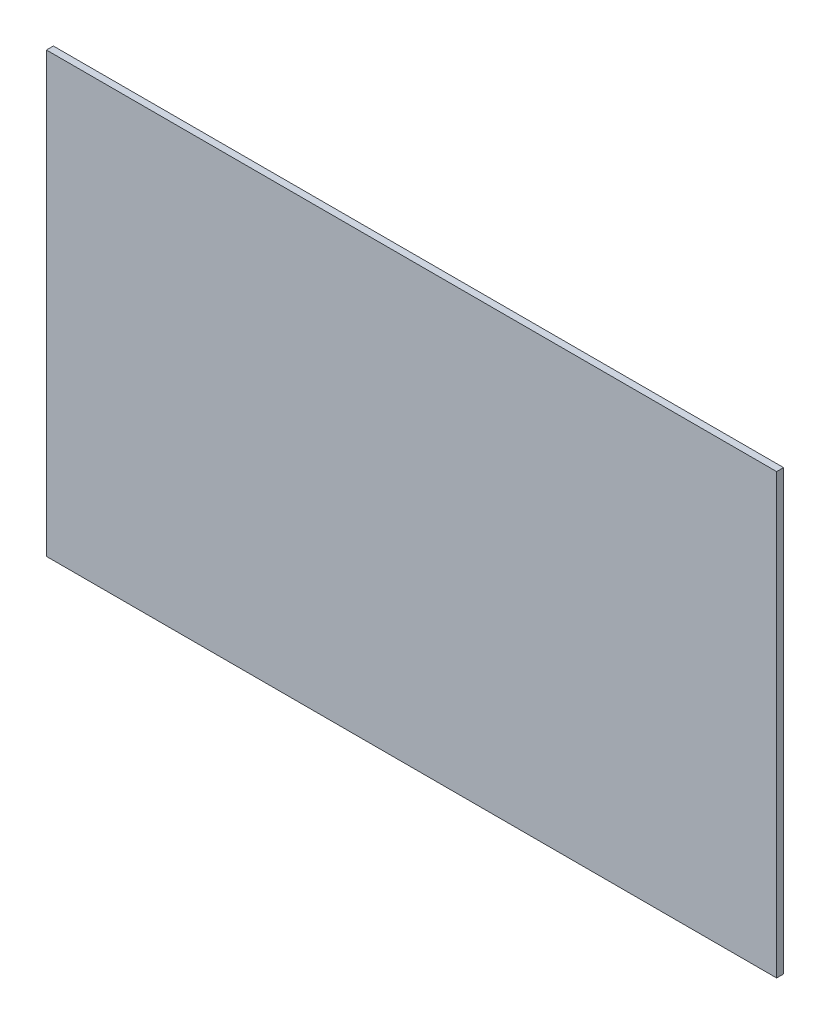
ISO-10303-21;
HEADER;
FILE_DESCRIPTION(('STEP AP214'),'2;1');
FILE_NAME('part.step','',(''),(''),'','','');
FILE_SCHEMA(('AUTOMOTIVE_DESIGN { 1 0 10303 214 1 1 1 1 }'));
ENDSEC;
DATA;
#1=APPLICATION_CONTEXT('core data for automotive mechanical design processes');
#2=APPLICATION_PROTOCOL_DEFINITION('international standard','automotive_design',2000,#1);
#3=PRODUCT_CONTEXT('',#1,'mechanical');
#4=PRODUCT('Part','Part','',(#3));
#5=PRODUCT_RELATED_PRODUCT_CATEGORY('part','',(#4));
#6=PRODUCT_DEFINITION_FORMATION('','',#4);
#7=PRODUCT_DEFINITION_CONTEXT('part definition',#1,'design');
#8=PRODUCT_DEFINITION('design','',#6,#7);
#9=PRODUCT_DEFINITION_SHAPE('','',#8);
#10=(LENGTH_UNIT() NAMED_UNIT(*) SI_UNIT(.MILLI.,.METRE.));
#11=(NAMED_UNIT(*) PLANE_ANGLE_UNIT() SI_UNIT($,.RADIAN.));
#12=(NAMED_UNIT(*) SI_UNIT($,.STERADIAN.) SOLID_ANGLE_UNIT());
#13=UNCERTAINTY_MEASURE_WITH_UNIT(LENGTH_MEASURE(1.E-05),#10,'distance_accuracy_value','');
#14=(GEOMETRIC_REPRESENTATION_CONTEXT(3) GLOBAL_UNCERTAINTY_ASSIGNED_CONTEXT((#13)) GLOBAL_UNIT_ASSIGNED_CONTEXT((#10,
#11,#12)) REPRESENTATION_CONTEXT('',''));
#15=CARTESIAN_POINT('',(0.,0.,0.));
#16=DIRECTION('',(0.,0.,1.));
#17=DIRECTION('',(1.,0.,0.));
#18=AXIS2_PLACEMENT_3D('',#15,#16,#17);
#19=CARTESIAN_POINT('',(-250.4,150.400000000001,4.75));
#20=DIRECTION('',(1.,0.,0.));
#21=DIRECTION('',(0.,1.,0.));
#22=AXIS2_PLACEMENT_3D('',#19,#20,#21);
#23=PLANE('',#22);
#24=DIRECTION('',(0.,-1.,0.));
#25=VECTOR('',#24,1.);
#26=CARTESIAN_POINT('',(-250.4,150.400000000001,0.));
#27=LINE('',#26,#25);
#28=CARTESIAN_POINT('',(-250.4,150.400000000001,0.));
#29=VERTEX_POINT('',#28);
#30=CARTESIAN_POINT('',(-250.4,-150.399999999999,0.));
#31=VERTEX_POINT('',#30);
#32=EDGE_CURVE('E97',#29,#31,#27,.T.);
#33=ORIENTED_EDGE('',*,*,#32,.T.);
#34=DIRECTION('',(0.,0.,-1.));
#35=VECTOR('',#34,1.);
#36=CARTESIAN_POINT('',(-250.4,-150.399999999999,4.75));
#37=LINE('',#36,#35);
#38=CARTESIAN_POINT('',(-250.4,-150.399999999999,4.75));
#39=VERTEX_POINT('',#38);
#40=EDGE_CURVE('E11',#39,#31,#37,.T.);
#41=ORIENTED_EDGE('',*,*,#40,.F.);
#42=DIRECTION('',(0.,-1.,0.));
#43=VECTOR('',#42,1.);
#44=CARTESIAN_POINT('',(-250.4,150.400000000001,4.75));
#45=LINE('',#44,#43);
#46=CARTESIAN_POINT('',(-250.4,150.400000000001,4.75));
#47=VERTEX_POINT('',#46);
#48=EDGE_CURVE('E83',#47,#39,#45,.T.);
#49=ORIENTED_EDGE('',*,*,#48,.F.);
#50=DIRECTION('',(0.,0.,-1.));
#51=VECTOR('',#50,1.);
#52=CARTESIAN_POINT('',(-250.4,150.400000000001,4.75));
#53=LINE('',#52,#51);
#54=EDGE_CURVE('E50',#47,#29,#53,.T.);
#55=ORIENTED_EDGE('',*,*,#54,.T.);
#56=EDGE_LOOP('',(#33,#41,#49,#55));
#57=FACE_BOUND('',#56,.T.);
#58=ADVANCED_FACE('F34',(#57),#23,.F.);
#59=CARTESIAN_POINT('',(-250.4,-150.399999999999,4.75));
#60=DIRECTION('',(0.,1.,0.));
#61=DIRECTION('',(0.,0.,1.));
#62=AXIS2_PLACEMENT_3D('',#59,#60,#61);
#63=PLANE('',#62);
#64=DIRECTION('',(1.,0.,0.));
#65=VECTOR('',#64,1.);
#66=CARTESIAN_POINT('',(-250.4,-150.399999999999,0.));
#67=LINE('',#66,#65);
#68=CARTESIAN_POINT('',(250.4,-150.399999999999,0.));
#69=VERTEX_POINT('',#68);
#70=EDGE_CURVE('E88',#31,#69,#67,.T.);
#71=ORIENTED_EDGE('',*,*,#70,.T.);
#72=DIRECTION('',(0.,0.,-1.));
#73=VECTOR('',#72,1.);
#74=CARTESIAN_POINT('',(250.4,-150.399999999999,4.75));
#75=LINE('',#74,#73);
#76=CARTESIAN_POINT('',(250.4,-150.399999999999,4.75));
#77=VERTEX_POINT('',#76);
#78=EDGE_CURVE('E42',#77,#69,#75,.T.);
#79=ORIENTED_EDGE('',*,*,#78,.F.);
#80=DIRECTION('',(1.,0.,0.));
#81=VECTOR('',#80,1.);
#82=CARTESIAN_POINT('',(-250.4,-150.399999999999,4.75));
#83=LINE('',#82,#81);
#84=EDGE_CURVE('E75',#39,#77,#83,.T.);
#85=ORIENTED_EDGE('',*,*,#84,.F.);
#86=ORIENTED_EDGE('',*,*,#40,.T.);
#87=EDGE_LOOP('',(#71,#79,#85,#86));
#88=FACE_BOUND('',#87,.T.);
#89=ADVANCED_FACE('F87',(#88),#63,.F.);
#90=CARTESIAN_POINT('',(250.4,150.400000000001,4.75));
#91=DIRECTION('',(1.,0.,0.));
#92=DIRECTION('',(0.,1.,0.));
#93=AXIS2_PLACEMENT_3D('',#90,#91,#92);
#94=PLANE('',#93);
#95=DIRECTION('',(0.,-1.,0.));
#96=VECTOR('',#95,1.);
#97=CARTESIAN_POINT('',(250.4,150.400000000001,0.));
#98=LINE('',#97,#96);
#99=CARTESIAN_POINT('',(250.4,150.400000000001,0.));
#100=VERTEX_POINT('',#99);
#101=EDGE_CURVE('E100',#100,#69,#98,.T.);
#102=ORIENTED_EDGE('',*,*,#101,.F.);
#103=DIRECTION('',(0.,0.,-1.));
#104=VECTOR('',#103,1.);
#105=CARTESIAN_POINT('',(250.4,150.400000000001,4.75));
#106=LINE('',#105,#104);
#107=CARTESIAN_POINT('',(250.4,150.400000000001,4.75));
#108=VERTEX_POINT('',#107);
#109=EDGE_CURVE('E64',#108,#100,#106,.T.);
#110=ORIENTED_EDGE('',*,*,#109,.F.);
#111=DIRECTION('',(0.,-1.,0.));
#112=VECTOR('',#111,1.);
#113=CARTESIAN_POINT('',(250.4,150.400000000001,4.75));
#114=LINE('',#113,#112);
#115=EDGE_CURVE('E82',#108,#77,#114,.T.);
#116=ORIENTED_EDGE('',*,*,#115,.T.);
#117=ORIENTED_EDGE('',*,*,#78,.T.);
#118=EDGE_LOOP('',(#102,#110,#116,#117));
#119=FACE_BOUND('',#118,.T.);
#120=ADVANCED_FACE('F91',(#119),#94,.T.);
#121=CARTESIAN_POINT('',(-250.4,150.400000000001,4.75));
#122=DIRECTION('',(0.,1.,0.));
#123=DIRECTION('',(0.,0.,1.));
#124=AXIS2_PLACEMENT_3D('',#121,#122,#123);
#125=PLANE('',#124);
#126=DIRECTION('',(1.,0.,0.));
#127=VECTOR('',#126,1.);
#128=CARTESIAN_POINT('',(-250.4,150.400000000001,0.));
#129=LINE('',#128,#127);
#130=EDGE_CURVE('E102',#29,#100,#129,.T.);
#131=ORIENTED_EDGE('',*,*,#130,.F.);
#132=ORIENTED_EDGE('',*,*,#54,.F.);
#133=DIRECTION('',(1.,0.,0.));
#134=VECTOR('',#133,1.);
#135=CARTESIAN_POINT('',(-250.4,150.400000000001,4.75));
#136=LINE('',#135,#134);
#137=EDGE_CURVE('E92',#47,#108,#136,.T.);
#138=ORIENTED_EDGE('',*,*,#137,.T.);
#139=ORIENTED_EDGE('',*,*,#109,.T.);
#140=EDGE_LOOP('',(#131,#132,#138,#139));
#141=FACE_BOUND('',#140,.T.);
#142=ADVANCED_FACE('F108',(#141),#125,.T.);
#143=CARTESIAN_POINT('',(0.,0.,4.75));
#144=DIRECTION('',(0.,0.,1.));
#145=DIRECTION('',(1.,0.,0.));
#146=AXIS2_PLACEMENT_3D('',#143,#144,#145);
#147=PLANE('',#146);
#148=ORIENTED_EDGE('',*,*,#48,.T.);
#149=ORIENTED_EDGE('',*,*,#84,.T.);
#150=ORIENTED_EDGE('',*,*,#115,.F.);
#151=ORIENTED_EDGE('',*,*,#137,.F.);
#152=EDGE_LOOP('',(#148,#149,#150,#151));
#153=FACE_BOUND('',#152,.T.);
#154=ADVANCED_FACE('F79',(#153),#147,.T.);
#155=CARTESIAN_POINT('',(0.,0.,0.));
#156=DIRECTION('',(0.,0.,1.));
#157=DIRECTION('',(1.,0.,0.));
#158=AXIS2_PLACEMENT_3D('',#155,#156,#157);
#159=PLANE('',#158);
#160=ORIENTED_EDGE('',*,*,#32,.F.);
#161=ORIENTED_EDGE('',*,*,#130,.T.);
#162=ORIENTED_EDGE('',*,*,#101,.T.);
#163=ORIENTED_EDGE('',*,*,#70,.F.);
#164=EDGE_LOOP('',(#160,#161,#162,#163));
#165=FACE_BOUND('',#164,.T.);
#166=ADVANCED_FACE('F107',(#165),#159,.F.);
#167=CLOSED_SHELL('',(#58,#89,#120,#142,#154,#166));
#168=MANIFOLD_SOLID_BREP('B2',#167);
#169=ADVANCED_BREP_SHAPE_REPRESENTATION('',(#18,#168),#14);
#170=SHAPE_DEFINITION_REPRESENTATION(#9,#169);
ENDSEC;
END-ISO-10303-21;
